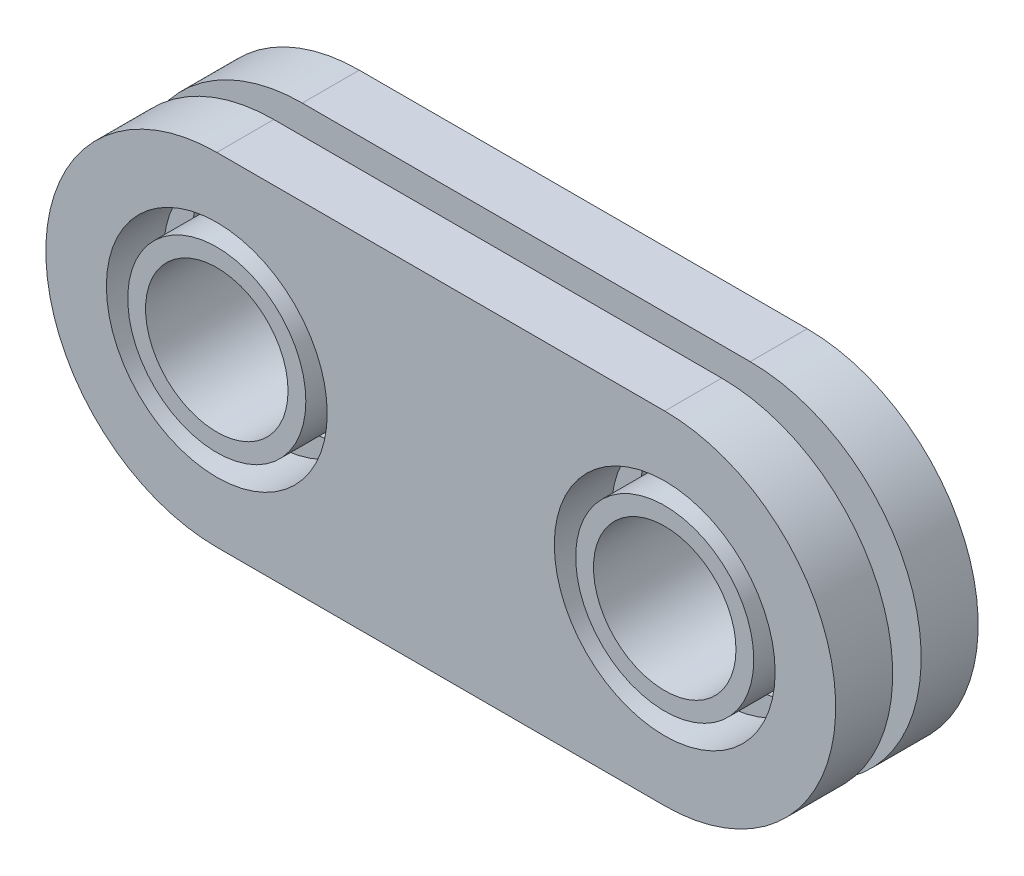
ISO-10303-21;
HEADER;
FILE_DESCRIPTION(('STEP AP214'),'2;1');
FILE_NAME('part.step','',(''),(''),'','','');
FILE_SCHEMA(('AUTOMOTIVE_DESIGN { 1 0 10303 214 1 1 1 1 }'));
ENDSEC;
DATA;
#1=APPLICATION_CONTEXT('core data for automotive mechanical design processes');
#2=APPLICATION_PROTOCOL_DEFINITION('international standard','automotive_design',2000,#1);
#3=PRODUCT_CONTEXT('',#1,'mechanical');
#4=PRODUCT('Part','Part','',(#3));
#5=PRODUCT_RELATED_PRODUCT_CATEGORY('part','',(#4));
#6=PRODUCT_DEFINITION_FORMATION('','',#4);
#7=PRODUCT_DEFINITION_CONTEXT('part definition',#1,'design');
#8=PRODUCT_DEFINITION('design','',#6,#7);
#9=PRODUCT_DEFINITION_SHAPE('','',#8);
#10=(LENGTH_UNIT() NAMED_UNIT(*) SI_UNIT(.MILLI.,.METRE.));
#11=(NAMED_UNIT(*) PLANE_ANGLE_UNIT() SI_UNIT($,.RADIAN.));
#12=(NAMED_UNIT(*) SI_UNIT($,.STERADIAN.) SOLID_ANGLE_UNIT());
#13=UNCERTAINTY_MEASURE_WITH_UNIT(LENGTH_MEASURE(1.E-05),#10,'distance_accuracy_value','');
#14=(GEOMETRIC_REPRESENTATION_CONTEXT(3) GLOBAL_UNCERTAINTY_ASSIGNED_CONTEXT((#13)) GLOBAL_UNIT_ASSIGNED_CONTEXT((#10,
#11,#12)) REPRESENTATION_CONTEXT('',''));
#15=CARTESIAN_POINT('',(0.,0.,0.));
#16=DIRECTION('',(0.,0.,1.));
#17=DIRECTION('',(1.,0.,0.));
#18=AXIS2_PLACEMENT_3D('',#15,#16,#17);
#19=CARTESIAN_POINT('',(6.28764255227391,0.,1.));
#20=DIRECTION('',(0.,0.,1.));
#21=DIRECTION('',(1.,0.,0.));
#22=AXIS2_PLACEMENT_3D('',#19,#20,#21);
#23=PLANE('',#22);
#24=CARTESIAN_POINT('',(6.28764255227391,0.,1.));
#25=DIRECTION('',(0.,0.,1.));
#26=DIRECTION('',(1.,0.,0.));
#27=AXIS2_PLACEMENT_3D('',#24,#25,#26);
#28=CIRCLE('',#27,1.25);
#29=CARTESIAN_POINT('',(7.53764255227391,0.,1.));
#30=VERTEX_POINT('',#29);
#31=EDGE_CURVE('E63',#30,#30,#28,.T.);
#32=ORIENTED_EDGE('',*,*,#31,.T.);
#33=EDGE_LOOP('',(#32));
#34=FACE_BOUND('',#33,.T.);
#35=CARTESIAN_POINT('',(6.28764255227391,0.,1.));
#36=DIRECTION('',(0.,0.,1.));
#37=DIRECTION('',(1.,0.,0.));
#38=AXIS2_PLACEMENT_3D('',#35,#36,#37);
#39=CIRCLE('',#38,1.);
#40=CARTESIAN_POINT('',(7.28764255227391,0.,1.));
#41=VERTEX_POINT('',#40);
#42=EDGE_CURVE('E55',#41,#41,#39,.T.);
#43=ORIENTED_EDGE('',*,*,#42,.F.);
#44=EDGE_LOOP('',(#43));
#45=FACE_BOUND('',#44,.T.);
#46=ADVANCED_FACE('F48',(#34,#45),#23,.T.);
#47=CARTESIAN_POINT('',(6.28764255227391,0.,-1.));
#48=DIRECTION('',(0.,0.,1.));
#49=DIRECTION('',(1.,0.,0.));
#50=AXIS2_PLACEMENT_3D('',#47,#48,#49);
#51=PLANE('',#50);
#52=CARTESIAN_POINT('',(6.28764255227391,0.,-1.));
#53=DIRECTION('',(0.,0.,1.));
#54=DIRECTION('',(1.,0.,0.));
#55=AXIS2_PLACEMENT_3D('',#52,#53,#54);
#56=CIRCLE('',#55,1.25);
#57=CARTESIAN_POINT('',(7.53764255227391,0.,-1.));
#58=VERTEX_POINT('',#57);
#59=EDGE_CURVE('E56',#58,#58,#56,.T.);
#60=ORIENTED_EDGE('',*,*,#59,.F.);
#61=EDGE_LOOP('',(#60));
#62=FACE_BOUND('',#61,.T.);
#63=CARTESIAN_POINT('',(6.28764255227391,0.,-1.));
#64=DIRECTION('',(0.,0.,1.));
#65=DIRECTION('',(1.,0.,0.));
#66=AXIS2_PLACEMENT_3D('',#63,#64,#65);
#67=CIRCLE('',#66,1.);
#68=CARTESIAN_POINT('',(7.28764255227391,0.,-1.));
#69=VERTEX_POINT('',#68);
#70=EDGE_CURVE('E11',#69,#69,#67,.T.);
#71=ORIENTED_EDGE('',*,*,#70,.T.);
#72=EDGE_LOOP('',(#71));
#73=FACE_BOUND('',#72,.T.);
#74=ADVANCED_FACE('F69',(#62,#73),#51,.F.);
#75=CARTESIAN_POINT('',(6.28764255227391,0.,1.));
#76=DIRECTION('',(0.,0.,-1.));
#77=DIRECTION('',(-1.,0.,0.));
#78=AXIS2_PLACEMENT_3D('',#75,#76,#77);
#79=CYLINDRICAL_SURFACE('',#78,1.25);
#80=ORIENTED_EDGE('',*,*,#31,.F.);
#81=EDGE_LOOP('',(#80));
#82=FACE_BOUND('',#81,.T.);
#83=ORIENTED_EDGE('',*,*,#59,.T.);
#84=EDGE_LOOP('',(#83));
#85=FACE_BOUND('',#84,.T.);
#86=ADVANCED_FACE('F70',(#82,#85),#79,.T.);
#87=CARTESIAN_POINT('',(6.28764255227391,0.,1.));
#88=DIRECTION('',(0.,0.,-1.));
#89=DIRECTION('',(-1.,0.,0.));
#90=AXIS2_PLACEMENT_3D('',#87,#88,#89);
#91=CYLINDRICAL_SURFACE('',#90,1.);
#92=ORIENTED_EDGE('',*,*,#42,.T.);
#93=EDGE_LOOP('',(#92));
#94=FACE_BOUND('',#93,.T.);
#95=ORIENTED_EDGE('',*,*,#70,.F.);
#96=EDGE_LOOP('',(#95));
#97=FACE_BOUND('',#96,.T.);
#98=ADVANCED_FACE('F49',(#94,#97),#91,.F.);
#99=CLOSED_SHELL('',(#46,#74,#86,#98));
#100=MANIFOLD_SOLID_BREP('B2',#99);
#101=CARTESIAN_POINT('',(0.,0.,1.));
#102=DIRECTION('',(0.,0.,1.));
#103=DIRECTION('',(1.,0.,0.));
#104=AXIS2_PLACEMENT_3D('',#101,#102,#103);
#105=PLANE('',#104);
#106=CARTESIAN_POINT('',(0.,0.,1.));
#107=DIRECTION('',(0.,0.,1.));
#108=DIRECTION('',(1.,0.,0.));
#109=AXIS2_PLACEMENT_3D('',#106,#107,#108);
#110=CIRCLE('',#109,1.25);
#111=CARTESIAN_POINT('',(1.25,0.,1.));
#112=VERTEX_POINT('',#111);
#113=EDGE_CURVE('E50',#112,#112,#110,.T.);
#114=ORIENTED_EDGE('',*,*,#113,.T.);
#115=EDGE_LOOP('',(#114));
#116=FACE_BOUND('',#115,.T.);
#117=CARTESIAN_POINT('',(0.,0.,1.));
#118=DIRECTION('',(0.,0.,1.));
#119=DIRECTION('',(1.,0.,0.));
#120=AXIS2_PLACEMENT_3D('',#117,#118,#119);
#121=CIRCLE('',#120,1.);
#122=CARTESIAN_POINT('',(1.,0.,1.));
#123=VERTEX_POINT('',#122);
#124=EDGE_CURVE('E133',#123,#123,#121,.T.);
#125=ORIENTED_EDGE('',*,*,#124,.F.);
#126=EDGE_LOOP('',(#125));
#127=FACE_BOUND('',#126,.T.);
#128=ADVANCED_FACE('F117',(#116,#127),#105,.T.);
#129=CARTESIAN_POINT('',(0.,0.,-1.));
#130=DIRECTION('',(0.,0.,1.));
#131=DIRECTION('',(1.,0.,0.));
#132=AXIS2_PLACEMENT_3D('',#129,#130,#131);
#133=PLANE('',#132);
#134=CARTESIAN_POINT('',(0.,0.,-1.));
#135=DIRECTION('',(0.,0.,1.));
#136=DIRECTION('',(1.,0.,0.));
#137=AXIS2_PLACEMENT_3D('',#134,#135,#136);
#138=CIRCLE('',#137,1.25);
#139=CARTESIAN_POINT('',(1.25,0.,-1.));
#140=VERTEX_POINT('',#139);
#141=EDGE_CURVE('E124',#140,#140,#138,.T.);
#142=ORIENTED_EDGE('',*,*,#141,.F.);
#143=EDGE_LOOP('',(#142));
#144=FACE_BOUND('',#143,.T.);
#145=CARTESIAN_POINT('',(0.,0.,-1.));
#146=DIRECTION('',(0.,0.,1.));
#147=DIRECTION('',(1.,0.,0.));
#148=AXIS2_PLACEMENT_3D('',#145,#146,#147);
#149=CIRCLE('',#148,1.);
#150=CARTESIAN_POINT('',(1.,0.,-1.));
#151=VERTEX_POINT('',#150);
#152=EDGE_CURVE('E131',#151,#151,#149,.T.);
#153=ORIENTED_EDGE('',*,*,#152,.T.);
#154=EDGE_LOOP('',(#153));
#155=FACE_BOUND('',#154,.T.);
#156=ADVANCED_FACE('F141',(#144,#155),#133,.F.);
#157=CARTESIAN_POINT('',(0.,0.,1.));
#158=DIRECTION('',(0.,0.,-1.));
#159=DIRECTION('',(-1.,0.,0.));
#160=AXIS2_PLACEMENT_3D('',#157,#158,#159);
#161=CYLINDRICAL_SURFACE('',#160,1.25);
#162=ORIENTED_EDGE('',*,*,#113,.F.);
#163=EDGE_LOOP('',(#162));
#164=FACE_BOUND('',#163,.T.);
#165=ORIENTED_EDGE('',*,*,#141,.T.);
#166=EDGE_LOOP('',(#165));
#167=FACE_BOUND('',#166,.T.);
#168=ADVANCED_FACE('F125',(#164,#167),#161,.T.);
#169=CARTESIAN_POINT('',(0.,0.,1.));
#170=DIRECTION('',(0.,0.,-1.));
#171=DIRECTION('',(-1.,0.,0.));
#172=AXIS2_PLACEMENT_3D('',#169,#170,#171);
#173=CYLINDRICAL_SURFACE('',#172,1.);
#174=ORIENTED_EDGE('',*,*,#124,.T.);
#175=EDGE_LOOP('',(#174));
#176=FACE_BOUND('',#175,.T.);
#177=ORIENTED_EDGE('',*,*,#152,.F.);
#178=EDGE_LOOP('',(#177));
#179=FACE_BOUND('',#178,.T.);
#180=ADVANCED_FACE('F139',(#176,#179),#173,.F.);
#181=CLOSED_SHELL('',(#128,#156,#168,#180));
#182=MANIFOLD_SOLID_BREP('B6',#181);
#183=CARTESIAN_POINT('',(0.,0.,-0.2));
#184=DIRECTION('',(0.,0.,1.));
#185=DIRECTION('',(1.,0.,0.));
#186=AXIS2_PLACEMENT_3D('',#183,#184,#185);
#187=PLANE('',#186);
#188=CARTESIAN_POINT('',(0.,0.,-0.2));
#189=DIRECTION('',(0.,0.,1.));
#190=DIRECTION('',(1.,0.,0.));
#191=AXIS2_PLACEMENT_3D('',#188,#189,#190);
#192=CIRCLE('',#191,1.55);
#193=CARTESIAN_POINT('',(1.55,0.,-0.2));
#194=VERTEX_POINT('',#193);
#195=EDGE_CURVE('E256',#194,#194,#192,.T.);
#196=ORIENTED_EDGE('',*,*,#195,.F.);
#197=EDGE_LOOP('',(#196));
#198=FACE_BOUND('',#197,.T.);
#199=CARTESIAN_POINT('',(0.,0.,-0.2));
#200=DIRECTION('',(0.,0.,1.));
#201=DIRECTION('',(1.,0.,0.));
#202=AXIS2_PLACEMENT_3D('',#199,#200,#201);
#203=CIRCLE('',#202,2.4);
#204=CARTESIAN_POINT('',(0.,2.4,-0.2));
#205=VERTEX_POINT('',#204);
#206=CARTESIAN_POINT('',(0.,-2.4,-0.2));
#207=VERTEX_POINT('',#206);
#208=EDGE_CURVE('E241',#205,#207,#203,.T.);
#209=ORIENTED_EDGE('',*,*,#208,.T.);
#210=DIRECTION('',(1.,0.,0.));
#211=VECTOR('',#210,1.);
#212=CARTESIAN_POINT('',(0.,-2.4,-0.2));
#213=LINE('',#212,#211);
#214=CARTESIAN_POINT('',(6.28764255227391,-2.4,-0.2));
#215=VERTEX_POINT('',#214);
#216=EDGE_CURVE('E236',#207,#215,#213,.T.);
#217=ORIENTED_EDGE('',*,*,#216,.T.);
#218=CARTESIAN_POINT('',(6.28764255227391,0.,-0.2));
#219=DIRECTION('',(0.,0.,1.));
#220=DIRECTION('',(1.,0.,0.));
#221=AXIS2_PLACEMENT_3D('',#218,#219,#220);
#222=CIRCLE('',#221,2.4);
#223=CARTESIAN_POINT('',(6.28764255227391,2.4,-0.2));
#224=VERTEX_POINT('',#223);
#225=EDGE_CURVE('E243',#215,#224,#222,.T.);
#226=ORIENTED_EDGE('',*,*,#225,.T.);
#227=DIRECTION('',(-1.,0.,0.));
#228=VECTOR('',#227,1.);
#229=CARTESIAN_POINT('',(6.28764255227391,2.4,-0.2));
#230=LINE('',#229,#228);
#231=EDGE_CURVE('E208',#224,#205,#230,.T.);
#232=ORIENTED_EDGE('',*,*,#231,.T.);
#233=EDGE_LOOP('',(#209,#217,#226,#232));
#234=FACE_BOUND('',#233,.T.);
#235=CARTESIAN_POINT('',(6.28764255227391,0.,-0.2));
#236=DIRECTION('',(0.,0.,1.));
#237=DIRECTION('',(1.,0.,0.));
#238=AXIS2_PLACEMENT_3D('',#235,#236,#237);
#239=CIRCLE('',#238,1.55);
#240=CARTESIAN_POINT('',(7.83764255227391,0.,-0.2));
#241=VERTEX_POINT('',#240);
#242=EDGE_CURVE('E272',#241,#241,#239,.T.);
#243=ORIENTED_EDGE('',*,*,#242,.F.);
#244=EDGE_LOOP('',(#243));
#245=FACE_BOUND('',#244,.T.);
#246=ADVANCED_FACE('F192',(#198,#234,#245),#187,.T.);
#247=CARTESIAN_POINT('',(0.,0.,-1.));
#248=DIRECTION('',(0.,0.,1.));
#249=DIRECTION('',(1.,0.,0.));
#250=AXIS2_PLACEMENT_3D('',#247,#248,#249);
#251=PLANE('',#250);
#252=CARTESIAN_POINT('',(0.,0.,-1.));
#253=DIRECTION('',(0.,0.,1.));
#254=DIRECTION('',(1.,0.,0.));
#255=AXIS2_PLACEMENT_3D('',#252,#253,#254);
#256=CIRCLE('',#255,2.4);
#257=CARTESIAN_POINT('',(0.,2.4,-1.));
#258=VERTEX_POINT('',#257);
#259=CARTESIAN_POINT('',(0.,-2.4,-1.));
#260=VERTEX_POINT('',#259);
#261=EDGE_CURVE('E254',#258,#260,#256,.T.);
#262=ORIENTED_EDGE('',*,*,#261,.F.);
#263=DIRECTION('',(-1.,0.,0.));
#264=VECTOR('',#263,1.);
#265=CARTESIAN_POINT('',(6.28764255227391,2.4,-1.));
#266=LINE('',#265,#264);
#267=CARTESIAN_POINT('',(6.28764255227391,2.4,-1.));
#268=VERTEX_POINT('',#267);
#269=EDGE_CURVE('E232',#268,#258,#266,.T.);
#270=ORIENTED_EDGE('',*,*,#269,.F.);
#271=CARTESIAN_POINT('',(6.28764255227391,0.,-1.));
#272=DIRECTION('',(0.,0.,1.));
#273=DIRECTION('',(1.,0.,0.));
#274=AXIS2_PLACEMENT_3D('',#271,#272,#273);
#275=CIRCLE('',#274,2.4);
#276=CARTESIAN_POINT('',(6.28764255227391,-2.4,-1.));
#277=VERTEX_POINT('',#276);
#278=EDGE_CURVE('E223',#277,#268,#275,.T.);
#279=ORIENTED_EDGE('',*,*,#278,.F.);
#280=DIRECTION('',(1.,0.,0.));
#281=VECTOR('',#280,1.);
#282=CARTESIAN_POINT('',(0.,-2.4,-1.));
#283=LINE('',#282,#281);
#284=EDGE_CURVE('E250',#260,#277,#283,.T.);
#285=ORIENTED_EDGE('',*,*,#284,.F.);
#286=EDGE_LOOP('',(#262,#270,#279,#285));
#287=FACE_BOUND('',#286,.T.);
#288=CARTESIAN_POINT('',(0.,0.,-1.));
#289=DIRECTION('',(0.,0.,1.));
#290=DIRECTION('',(1.,0.,0.));
#291=AXIS2_PLACEMENT_3D('',#288,#289,#290);
#292=CIRCLE('',#291,1.55);
#293=CARTESIAN_POINT('',(1.55,0.,-1.));
#294=VERTEX_POINT('',#293);
#295=EDGE_CURVE('E269',#294,#294,#292,.T.);
#296=ORIENTED_EDGE('',*,*,#295,.T.);
#297=EDGE_LOOP('',(#296));
#298=FACE_BOUND('',#297,.T.);
#299=CARTESIAN_POINT('',(6.28764255227391,0.,-1.));
#300=DIRECTION('',(0.,0.,1.));
#301=DIRECTION('',(1.,0.,0.));
#302=AXIS2_PLACEMENT_3D('',#299,#300,#301);
#303=CIRCLE('',#302,1.55);
#304=CARTESIAN_POINT('',(7.83764255227391,0.,-1.));
#305=VERTEX_POINT('',#304);
#306=EDGE_CURVE('E277',#305,#305,#303,.T.);
#307=ORIENTED_EDGE('',*,*,#306,.T.);
#308=EDGE_LOOP('',(#307));
#309=FACE_BOUND('',#308,.T.);
#310=ADVANCED_FACE('F266',(#287,#298,#309),#251,.F.);
#311=CARTESIAN_POINT('',(0.,0.,-0.2));
#312=DIRECTION('',(0.,0.,-1.));
#313=DIRECTION('',(-1.,0.,0.));
#314=AXIS2_PLACEMENT_3D('',#311,#312,#313);
#315=CYLINDRICAL_SURFACE('',#314,2.4);
#316=ORIENTED_EDGE('',*,*,#261,.T.);
#317=DIRECTION('',(0.,0.,-1.));
#318=VECTOR('',#317,1.);
#319=CARTESIAN_POINT('',(0.,-2.4,-0.2));
#320=LINE('',#319,#318);
#321=EDGE_CURVE('E116',#207,#260,#320,.T.);
#322=ORIENTED_EDGE('',*,*,#321,.F.);
#323=ORIENTED_EDGE('',*,*,#208,.F.);
#324=DIRECTION('',(0.,0.,-1.));
#325=VECTOR('',#324,1.);
#326=CARTESIAN_POINT('',(0.,2.4,-0.2));
#327=LINE('',#326,#325);
#328=EDGE_CURVE('E253',#205,#258,#327,.T.);
#329=ORIENTED_EDGE('',*,*,#328,.T.);
#330=EDGE_LOOP('',(#316,#322,#323,#329));
#331=FACE_BOUND('',#330,.T.);
#332=ADVANCED_FACE('F193',(#331),#315,.T.);
#333=CARTESIAN_POINT('',(0.,-2.4,-0.2));
#334=DIRECTION('',(0.,1.,0.));
#335=DIRECTION('',(0.,0.,1.));
#336=AXIS2_PLACEMENT_3D('',#333,#334,#335);
#337=PLANE('',#336);
#338=ORIENTED_EDGE('',*,*,#284,.T.);
#339=DIRECTION('',(0.,0.,-1.));
#340=VECTOR('',#339,1.);
#341=CARTESIAN_POINT('',(6.28764255227391,-2.4,-0.2));
#342=LINE('',#341,#340);
#343=EDGE_CURVE('E199',#215,#277,#342,.T.);
#344=ORIENTED_EDGE('',*,*,#343,.F.);
#345=ORIENTED_EDGE('',*,*,#216,.F.);
#346=ORIENTED_EDGE('',*,*,#321,.T.);
#347=EDGE_LOOP('',(#338,#344,#345,#346));
#348=FACE_BOUND('',#347,.T.);
#349=ADVANCED_FACE('F247',(#348),#337,.F.);
#350=CARTESIAN_POINT('',(6.28764255227391,0.,-0.2));
#351=DIRECTION('',(0.,0.,-1.));
#352=DIRECTION('',(-1.,0.,0.));
#353=AXIS2_PLACEMENT_3D('',#350,#351,#352);
#354=CYLINDRICAL_SURFACE('',#353,2.4);
#355=ORIENTED_EDGE('',*,*,#278,.T.);
#356=DIRECTION('',(0.,0.,-1.));
#357=VECTOR('',#356,1.);
#358=CARTESIAN_POINT('',(6.28764255227391,2.4,-0.2));
#359=LINE('',#358,#357);
#360=EDGE_CURVE('E248',#224,#268,#359,.T.);
#361=ORIENTED_EDGE('',*,*,#360,.F.);
#362=ORIENTED_EDGE('',*,*,#225,.F.);
#363=ORIENTED_EDGE('',*,*,#343,.T.);
#364=EDGE_LOOP('',(#355,#361,#362,#363));
#365=FACE_BOUND('',#364,.T.);
#366=ADVANCED_FACE('F249',(#365),#354,.T.);
#367=CARTESIAN_POINT('',(6.28764255227391,2.4,-0.2));
#368=DIRECTION('',(0.,-1.,0.));
#369=DIRECTION('',(0.,0.,-1.));
#370=AXIS2_PLACEMENT_3D('',#367,#368,#369);
#371=PLANE('',#370);
#372=ORIENTED_EDGE('',*,*,#269,.T.);
#373=ORIENTED_EDGE('',*,*,#328,.F.);
#374=ORIENTED_EDGE('',*,*,#231,.F.);
#375=ORIENTED_EDGE('',*,*,#360,.T.);
#376=EDGE_LOOP('',(#372,#373,#374,#375));
#377=FACE_BOUND('',#376,.T.);
#378=ADVANCED_FACE('F263',(#377),#371,.F.);
#379=CARTESIAN_POINT('',(0.,0.,-0.2));
#380=DIRECTION('',(0.,0.,-1.));
#381=DIRECTION('',(-1.,0.,0.));
#382=AXIS2_PLACEMENT_3D('',#379,#380,#381);
#383=CYLINDRICAL_SURFACE('',#382,1.55);
#384=ORIENTED_EDGE('',*,*,#195,.T.);
#385=EDGE_LOOP('',(#384));
#386=FACE_BOUND('',#385,.T.);
#387=ORIENTED_EDGE('',*,*,#295,.F.);
#388=EDGE_LOOP('',(#387));
#389=FACE_BOUND('',#388,.T.);
#390=ADVANCED_FACE('F291',(#386,#389),#383,.F.);
#391=CARTESIAN_POINT('',(6.28764255227391,0.,-0.2));
#392=DIRECTION('',(0.,0.,-1.));
#393=DIRECTION('',(-1.,0.,0.));
#394=AXIS2_PLACEMENT_3D('',#391,#392,#393);
#395=CYLINDRICAL_SURFACE('',#394,1.55);
#396=ORIENTED_EDGE('',*,*,#242,.T.);
#397=EDGE_LOOP('',(#396));
#398=FACE_BOUND('',#397,.T.);
#399=ORIENTED_EDGE('',*,*,#306,.F.);
#400=EDGE_LOOP('',(#399));
#401=FACE_BOUND('',#400,.T.);
#402=ADVANCED_FACE('F285',(#398,#401),#395,.F.);
#403=CLOSED_SHELL('',(#246,#310,#332,#349,#366,#378,#390,#402));
#404=MANIFOLD_SOLID_BREP('B45',#403);
#405=CARTESIAN_POINT('',(0.,0.,1.));
#406=DIRECTION('',(0.,0.,1.));
#407=DIRECTION('',(1.,0.,0.));
#408=AXIS2_PLACEMENT_3D('',#405,#406,#407);
#409=PLANE('',#408);
#410=CARTESIAN_POINT('',(0.,0.,1.));
#411=DIRECTION('',(0.,0.,1.));
#412=DIRECTION('',(1.,0.,0.));
#413=AXIS2_PLACEMENT_3D('',#410,#411,#412);
#414=CIRCLE('',#413,1.55);
#415=CARTESIAN_POINT('',(1.55,0.,1.));
#416=VERTEX_POINT('',#415);
#417=EDGE_CURVE('E424',#416,#416,#414,.T.);
#418=ORIENTED_EDGE('',*,*,#417,.F.);
#419=EDGE_LOOP('',(#418));
#420=FACE_BOUND('',#419,.T.);
#421=CARTESIAN_POINT('',(0.,0.,1.));
#422=DIRECTION('',(0.,0.,1.));
#423=DIRECTION('',(1.,0.,0.));
#424=AXIS2_PLACEMENT_3D('',#421,#422,#423);
#425=CIRCLE('',#424,2.4);
#426=CARTESIAN_POINT('',(0.,2.4,1.));
#427=VERTEX_POINT('',#426);
#428=CARTESIAN_POINT('',(0.,-2.4,1.));
#429=VERTEX_POINT('',#428);
#430=EDGE_CURVE('E409',#427,#429,#425,.T.);
#431=ORIENTED_EDGE('',*,*,#430,.T.);
#432=DIRECTION('',(1.,0.,0.));
#433=VECTOR('',#432,1.);
#434=CARTESIAN_POINT('',(0.,-2.4,1.));
#435=LINE('',#434,#433);
#436=CARTESIAN_POINT('',(6.28764255227391,-2.4,1.));
#437=VERTEX_POINT('',#436);
#438=EDGE_CURVE('E404',#429,#437,#435,.T.);
#439=ORIENTED_EDGE('',*,*,#438,.T.);
#440=CARTESIAN_POINT('',(6.28764255227391,0.,1.));
#441=DIRECTION('',(0.,0.,1.));
#442=DIRECTION('',(1.,0.,0.));
#443=AXIS2_PLACEMENT_3D('',#440,#441,#442);
#444=CIRCLE('',#443,2.4);
#445=CARTESIAN_POINT('',(6.28764255227391,2.4,1.));
#446=VERTEX_POINT('',#445);
#447=EDGE_CURVE('E410',#437,#446,#444,.T.);
#448=ORIENTED_EDGE('',*,*,#447,.T.);
#449=DIRECTION('',(-1.,0.,0.));
#450=VECTOR('',#449,1.);
#451=CARTESIAN_POINT('',(6.28764255227391,2.4,1.));
#452=LINE('',#451,#450);
#453=EDGE_CURVE('E372',#446,#427,#452,.T.);
#454=ORIENTED_EDGE('',*,*,#453,.T.);
#455=EDGE_LOOP('',(#431,#439,#448,#454));
#456=FACE_BOUND('',#455,.T.);
#457=CARTESIAN_POINT('',(6.28764255227391,0.,1.));
#458=DIRECTION('',(0.,0.,1.));
#459=DIRECTION('',(1.,0.,0.));
#460=AXIS2_PLACEMENT_3D('',#457,#458,#459);
#461=CIRCLE('',#460,1.55);
#462=CARTESIAN_POINT('',(7.83764255227391,0.,1.));
#463=VERTEX_POINT('',#462);
#464=EDGE_CURVE('E438',#463,#463,#461,.T.);
#465=ORIENTED_EDGE('',*,*,#464,.F.);
#466=EDGE_LOOP('',(#465));
#467=FACE_BOUND('',#466,.T.);
#468=ADVANCED_FACE('F360',(#420,#456,#467),#409,.T.);
#469=CARTESIAN_POINT('',(0.,0.,0.2));
#470=DIRECTION('',(0.,0.,1.));
#471=DIRECTION('',(1.,0.,0.));
#472=AXIS2_PLACEMENT_3D('',#469,#470,#471);
#473=PLANE('',#472);
#474=CARTESIAN_POINT('',(0.,0.,0.2));
#475=DIRECTION('',(0.,0.,1.));
#476=DIRECTION('',(1.,0.,0.));
#477=AXIS2_PLACEMENT_3D('',#474,#475,#476);
#478=CIRCLE('',#477,2.4);
#479=CARTESIAN_POINT('',(0.,2.4,0.2));
#480=VERTEX_POINT('',#479);
#481=CARTESIAN_POINT('',(0.,-2.4,0.2));
#482=VERTEX_POINT('',#481);
#483=EDGE_CURVE('E423',#480,#482,#478,.T.);
#484=ORIENTED_EDGE('',*,*,#483,.F.);
#485=DIRECTION('',(-1.,0.,0.));
#486=VECTOR('',#485,1.);
#487=CARTESIAN_POINT('',(6.28764255227391,2.4,0.2));
#488=LINE('',#487,#486);
#489=CARTESIAN_POINT('',(6.28764255227391,2.4,0.2));
#490=VERTEX_POINT('',#489);
#491=EDGE_CURVE('E400',#490,#480,#488,.T.);
#492=ORIENTED_EDGE('',*,*,#491,.F.);
#493=CARTESIAN_POINT('',(6.28764255227391,0.,0.2));
#494=DIRECTION('',(0.,0.,1.));
#495=DIRECTION('',(1.,0.,0.));
#496=AXIS2_PLACEMENT_3D('',#493,#494,#495);
#497=CIRCLE('',#496,2.4);
#498=CARTESIAN_POINT('',(6.28764255227391,-2.4,0.2));
#499=VERTEX_POINT('',#498);
#500=EDGE_CURVE('E393',#499,#490,#497,.T.);
#501=ORIENTED_EDGE('',*,*,#500,.F.);
#502=DIRECTION('',(1.,0.,0.));
#503=VECTOR('',#502,1.);
#504=CARTESIAN_POINT('',(0.,-2.4,0.2));
#505=LINE('',#504,#503);
#506=EDGE_CURVE('E413',#482,#499,#505,.T.);
#507=ORIENTED_EDGE('',*,*,#506,.F.);
#508=EDGE_LOOP('',(#484,#492,#501,#507));
#509=FACE_BOUND('',#508,.T.);
#510=CARTESIAN_POINT('',(0.,0.,0.2));
#511=DIRECTION('',(0.,0.,1.));
#512=DIRECTION('',(1.,0.,0.));
#513=AXIS2_PLACEMENT_3D('',#510,#511,#512);
#514=CIRCLE('',#513,1.55);
#515=CARTESIAN_POINT('',(1.55,0.,0.2));
#516=VERTEX_POINT('',#515);
#517=EDGE_CURVE('E436',#516,#516,#514,.T.);
#518=ORIENTED_EDGE('',*,*,#517,.T.);
#519=EDGE_LOOP('',(#518));
#520=FACE_BOUND('',#519,.T.);
#521=CARTESIAN_POINT('',(6.28764255227391,0.,0.2));
#522=DIRECTION('',(0.,0.,1.));
#523=DIRECTION('',(1.,0.,0.));
#524=AXIS2_PLACEMENT_3D('',#521,#522,#523);
#525=CIRCLE('',#524,1.55);
#526=CARTESIAN_POINT('',(7.83764255227391,0.,0.2));
#527=VERTEX_POINT('',#526);
#528=EDGE_CURVE('E445',#527,#527,#525,.T.);
#529=ORIENTED_EDGE('',*,*,#528,.T.);
#530=EDGE_LOOP('',(#529));
#531=FACE_BOUND('',#530,.T.);
#532=ADVANCED_FACE('F435',(#509,#520,#531),#473,.F.);
#533=CARTESIAN_POINT('',(0.,0.,1.));
#534=DIRECTION('',(0.,0.,-1.));
#535=DIRECTION('',(-1.,0.,0.));
#536=AXIS2_PLACEMENT_3D('',#533,#534,#535);
#537=CYLINDRICAL_SURFACE('',#536,2.4);
#538=ORIENTED_EDGE('',*,*,#483,.T.);
#539=DIRECTION('',(0.,0.,-1.));
#540=VECTOR('',#539,1.);
#541=CARTESIAN_POINT('',(0.,-2.4,1.));
#542=LINE('',#541,#540);
#543=EDGE_CURVE('E189',#429,#482,#542,.T.);
#544=ORIENTED_EDGE('',*,*,#543,.F.);
#545=ORIENTED_EDGE('',*,*,#430,.F.);
#546=DIRECTION('',(0.,0.,-1.));
#547=VECTOR('',#546,1.);
#548=CARTESIAN_POINT('',(0.,2.4,1.));
#549=LINE('',#548,#547);
#550=EDGE_CURVE('E417',#427,#480,#549,.T.);
#551=ORIENTED_EDGE('',*,*,#550,.T.);
#552=EDGE_LOOP('',(#538,#544,#545,#551));
#553=FACE_BOUND('',#552,.T.);
#554=ADVANCED_FACE('F359',(#553),#537,.T.);
#555=CARTESIAN_POINT('',(0.,-2.4,1.));
#556=DIRECTION('',(0.,1.,0.));
#557=DIRECTION('',(0.,0.,1.));
#558=AXIS2_PLACEMENT_3D('',#555,#556,#557);
#559=PLANE('',#558);
#560=ORIENTED_EDGE('',*,*,#506,.T.);
#561=DIRECTION('',(0.,0.,-1.));
#562=VECTOR('',#561,1.);
#563=CARTESIAN_POINT('',(6.28764255227391,-2.4,1.));
#564=LINE('',#563,#562);
#565=EDGE_CURVE('E368',#437,#499,#564,.T.);
#566=ORIENTED_EDGE('',*,*,#565,.F.);
#567=ORIENTED_EDGE('',*,*,#438,.F.);
#568=ORIENTED_EDGE('',*,*,#543,.T.);
#569=EDGE_LOOP('',(#560,#566,#567,#568));
#570=FACE_BOUND('',#569,.T.);
#571=ADVANCED_FACE('F415',(#570),#559,.F.);
#572=CARTESIAN_POINT('',(6.28764255227391,0.,1.));
#573=DIRECTION('',(0.,0.,-1.));
#574=DIRECTION('',(-1.,0.,0.));
#575=AXIS2_PLACEMENT_3D('',#572,#573,#574);
#576=CYLINDRICAL_SURFACE('',#575,2.4);
#577=ORIENTED_EDGE('',*,*,#500,.T.);
#578=DIRECTION('',(0.,0.,-1.));
#579=VECTOR('',#578,1.);
#580=CARTESIAN_POINT('',(6.28764255227391,2.4,1.));
#581=LINE('',#580,#579);
#582=EDGE_CURVE('E414',#446,#490,#581,.T.);
#583=ORIENTED_EDGE('',*,*,#582,.F.);
#584=ORIENTED_EDGE('',*,*,#447,.F.);
#585=ORIENTED_EDGE('',*,*,#565,.T.);
#586=EDGE_LOOP('',(#577,#583,#584,#585));
#587=FACE_BOUND('',#586,.T.);
#588=ADVANCED_FACE('F411',(#587),#576,.T.);
#589=CARTESIAN_POINT('',(6.28764255227391,2.4,1.));
#590=DIRECTION('',(0.,-1.,0.));
#591=DIRECTION('',(0.,0.,-1.));
#592=AXIS2_PLACEMENT_3D('',#589,#590,#591);
#593=PLANE('',#592);
#594=ORIENTED_EDGE('',*,*,#491,.T.);
#595=ORIENTED_EDGE('',*,*,#550,.F.);
#596=ORIENTED_EDGE('',*,*,#453,.F.);
#597=ORIENTED_EDGE('',*,*,#582,.T.);
#598=EDGE_LOOP('',(#594,#595,#596,#597));
#599=FACE_BOUND('',#598,.T.);
#600=ADVANCED_FACE('F427',(#599),#593,.F.);
#601=CARTESIAN_POINT('',(0.,0.,1.));
#602=DIRECTION('',(0.,0.,-1.));
#603=DIRECTION('',(-1.,0.,0.));
#604=AXIS2_PLACEMENT_3D('',#601,#602,#603);
#605=CYLINDRICAL_SURFACE('',#604,1.55);
#606=ORIENTED_EDGE('',*,*,#417,.T.);
#607=EDGE_LOOP('',(#606));
#608=FACE_BOUND('',#607,.T.);
#609=ORIENTED_EDGE('',*,*,#517,.F.);
#610=EDGE_LOOP('',(#609));
#611=FACE_BOUND('',#610,.T.);
#612=ADVANCED_FACE('F459',(#608,#611),#605,.F.);
#613=CARTESIAN_POINT('',(6.28764255227391,0.,1.));
#614=DIRECTION('',(0.,0.,-1.));
#615=DIRECTION('',(-1.,0.,0.));
#616=AXIS2_PLACEMENT_3D('',#613,#614,#615);
#617=CYLINDRICAL_SURFACE('',#616,1.55);
#618=ORIENTED_EDGE('',*,*,#464,.T.);
#619=EDGE_LOOP('',(#618));
#620=FACE_BOUND('',#619,.T.);
#621=ORIENTED_EDGE('',*,*,#528,.F.);
#622=EDGE_LOOP('',(#621));
#623=FACE_BOUND('',#622,.T.);
#624=ADVANCED_FACE('F446',(#620,#623),#617,.F.);
#625=CLOSED_SHELL('',(#468,#532,#554,#571,#588,#600,#612,#624));
#626=MANIFOLD_SOLID_BREP('B115',#625);
#627=ADVANCED_BREP_SHAPE_REPRESENTATION('',(#18,#100,#182,#404,#626),#14);
#628=SHAPE_DEFINITION_REPRESENTATION(#9,#627);
ENDSEC;
END-ISO-10303-21;
